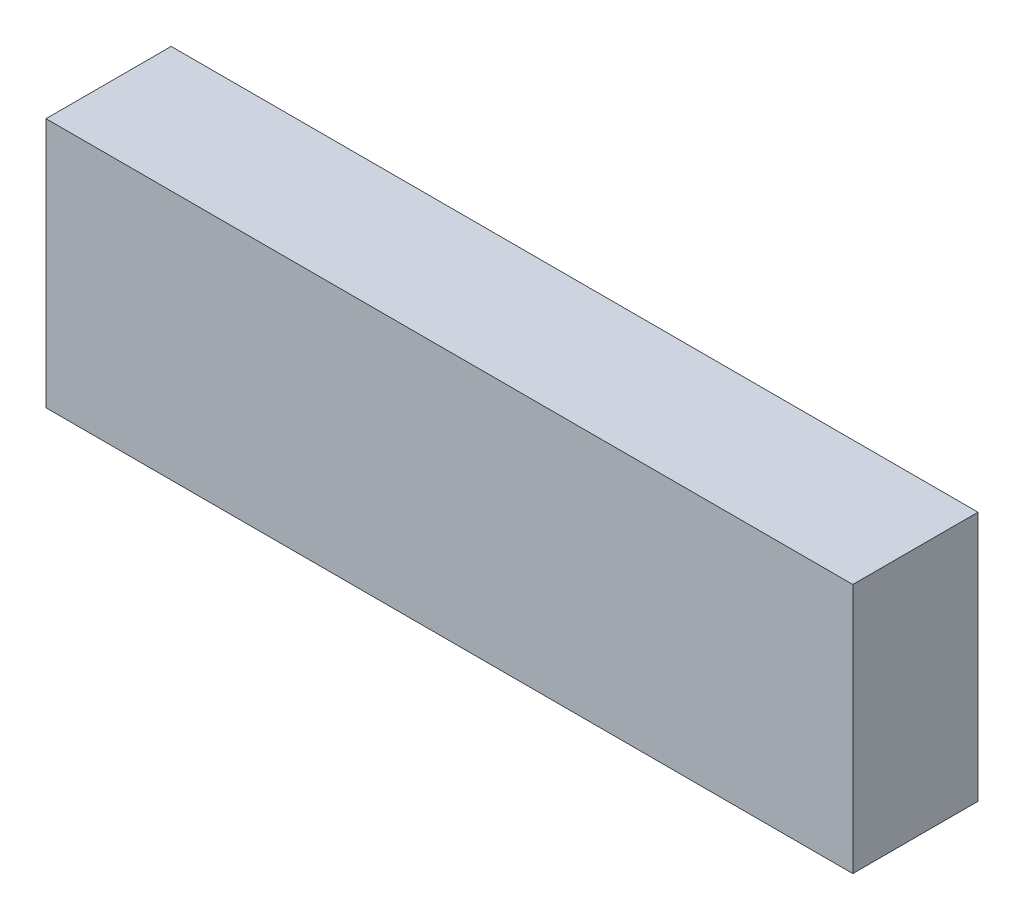
ISO-10303-21;
HEADER;
FILE_DESCRIPTION(('STEP AP214'),'2;1');
FILE_NAME('part.step','',(''),(''),'','','');
FILE_SCHEMA(('AUTOMOTIVE_DESIGN { 1 0 10303 214 1 1 1 1 }'));
ENDSEC;
DATA;
#1=APPLICATION_CONTEXT('core data for automotive mechanical design processes');
#2=APPLICATION_PROTOCOL_DEFINITION('international standard','automotive_design',2000,#1);
#3=PRODUCT_CONTEXT('',#1,'mechanical');
#4=PRODUCT('Part','Part','',(#3));
#5=PRODUCT_RELATED_PRODUCT_CATEGORY('part','',(#4));
#6=PRODUCT_DEFINITION_FORMATION('','',#4);
#7=PRODUCT_DEFINITION_CONTEXT('part definition',#1,'design');
#8=PRODUCT_DEFINITION('design','',#6,#7);
#9=PRODUCT_DEFINITION_SHAPE('','',#8);
#10=(LENGTH_UNIT() NAMED_UNIT(*) SI_UNIT(.MILLI.,.METRE.));
#11=(NAMED_UNIT(*) PLANE_ANGLE_UNIT() SI_UNIT($,.RADIAN.));
#12=(NAMED_UNIT(*) SI_UNIT($,.STERADIAN.) SOLID_ANGLE_UNIT());
#13=UNCERTAINTY_MEASURE_WITH_UNIT(LENGTH_MEASURE(1.E-05),#10,'distance_accuracy_value','');
#14=(GEOMETRIC_REPRESENTATION_CONTEXT(3) GLOBAL_UNCERTAINTY_ASSIGNED_CONTEXT((#13)) GLOBAL_UNIT_ASSIGNED_CONTEXT((#10,
#11,#12)) REPRESENTATION_CONTEXT('',''));
#15=CARTESIAN_POINT('',(0.,0.,0.));
#16=DIRECTION('',(0.,0.,1.));
#17=DIRECTION('',(1.,0.,0.));
#18=AXIS2_PLACEMENT_3D('',#15,#16,#17);
#19=CARTESIAN_POINT('',(72.4999999999995,547.758892294612,-402.857743681072));
#20=DIRECTION('',(0.,0.,1.));
#21=DIRECTION('',(1.,0.,0.));
#22=AXIS2_PLACEMENT_3D('',#19,#20,#21);
#23=PLANE('',#22);
#24=DIRECTION('',(1.,0.,0.));
#25=VECTOR('',#24,1.);
#26=CARTESIAN_POINT('',(-72.5000000000005,547.758892294612,-402.857743681072));
#27=LINE('',#26,#25);
#28=CARTESIAN_POINT('',(72.4999999999995,547.758892294612,-402.857743681072));
#29=VERTEX_POINT('',#28);
#30=CARTESIAN_POINT('',(-72.5000000000005,547.758892294612,-402.857743681072));
#31=VERTEX_POINT('',#30);
#32=EDGE_CURVE('E68',#29,#31,#27,.F.);
#33=ORIENTED_EDGE('',*,*,#32,.F.);
#34=DIRECTION('',(0.,1.,0.));
#35=VECTOR('',#34,1.);
#36=CARTESIAN_POINT('',(72.4999999999995,547.758892294612,-402.857743681072));
#37=LINE('',#36,#35);
#38=CARTESIAN_POINT('',(72.4999999999995,592.758892294612,-402.857743681072));
#39=VERTEX_POINT('',#38);
#40=EDGE_CURVE('E55',#39,#29,#37,.F.);
#41=ORIENTED_EDGE('',*,*,#40,.F.);
#42=DIRECTION('',(1.,0.,0.));
#43=VECTOR('',#42,1.);
#44=CARTESIAN_POINT('',(-72.5000000000005,592.758892294612,-402.857743681072));
#45=LINE('',#44,#43);
#46=CARTESIAN_POINT('',(-72.5000000000005,592.758892294612,-402.857743681072));
#47=VERTEX_POINT('',#46);
#48=EDGE_CURVE('E20',#39,#47,#45,.F.);
#49=ORIENTED_EDGE('',*,*,#48,.T.);
#50=DIRECTION('',(0.,-1.,0.));
#51=VECTOR('',#50,1.);
#52=CARTESIAN_POINT('',(-72.5000000000004,592.758892294612,-402.857743681072));
#53=LINE('',#52,#51);
#54=EDGE_CURVE('E81',#31,#47,#53,.F.);
#55=ORIENTED_EDGE('',*,*,#54,.F.);
#56=EDGE_LOOP('',(#33,#41,#49,#55));
#57=FACE_BOUND('',#56,.T.);
#58=ADVANCED_FACE('F17',(#57),#23,.T.);
#59=CARTESIAN_POINT('',(-72.5000000000005,592.758892294612,-425.357743681072));
#60=DIRECTION('',(0.,-1.,0.));
#61=DIRECTION('',(1.,0.,0.));
#62=AXIS2_PLACEMENT_3D('',#59,#60,#61);
#63=PLANE('',#62);
#64=DIRECTION('',(0.,0.,1.));
#65=VECTOR('',#64,1.);
#66=CARTESIAN_POINT('',(-72.5000000000004,592.758892294612,-425.357743681072));
#67=LINE('',#66,#65);
#68=CARTESIAN_POINT('',(-72.5000000000005,592.758892294612,-425.357743681072));
#69=VERTEX_POINT('',#68);
#70=EDGE_CURVE('E64',#47,#69,#67,.F.);
#71=ORIENTED_EDGE('',*,*,#70,.F.);
#72=ORIENTED_EDGE('',*,*,#48,.F.);
#73=DIRECTION('',(0.,0.,1.));
#74=VECTOR('',#73,1.);
#75=CARTESIAN_POINT('',(72.4999999999995,592.758892294612,-425.357743681072));
#76=LINE('',#75,#74);
#77=CARTESIAN_POINT('',(72.4999999999995,592.758892294612,-425.357743681072));
#78=VERTEX_POINT('',#77);
#79=EDGE_CURVE('E61',#78,#39,#76,.T.);
#80=ORIENTED_EDGE('',*,*,#79,.F.);
#81=DIRECTION('',(-1.,0.,0.));
#82=VECTOR('',#81,1.);
#83=CARTESIAN_POINT('',(72.4999999999996,592.758892294612,-425.357743681072));
#84=LINE('',#83,#82);
#85=EDGE_CURVE('E83',#69,#78,#84,.F.);
#86=ORIENTED_EDGE('',*,*,#85,.F.);
#87=EDGE_LOOP('',(#71,#72,#80,#86));
#88=FACE_BOUND('',#87,.T.);
#89=ADVANCED_FACE('F60',(#88),#63,.F.);
#90=CARTESIAN_POINT('',(72.4999999999995,547.758892294612,-425.357743681072));
#91=DIRECTION('',(1.,0.,0.));
#92=DIRECTION('',(0.,1.,0.));
#93=AXIS2_PLACEMENT_3D('',#90,#91,#92);
#94=PLANE('',#93);
#95=DIRECTION('',(0.,0.,1.));
#96=VECTOR('',#95,1.);
#97=CARTESIAN_POINT('',(72.4999999999995,547.758892294612,-425.357743681072));
#98=LINE('',#97,#96);
#99=CARTESIAN_POINT('',(72.4999999999995,547.758892294612,-425.357743681072));
#100=VERTEX_POINT('',#99);
#101=EDGE_CURVE('E70',#100,#29,#98,.T.);
#102=ORIENTED_EDGE('',*,*,#101,.F.);
#103=DIRECTION('',(0.,1.,0.));
#104=VECTOR('',#103,1.);
#105=CARTESIAN_POINT('',(72.4999999999995,592.758892294612,-425.357743681072));
#106=LINE('',#105,#104);
#107=EDGE_CURVE('E74',#78,#100,#106,.F.);
#108=ORIENTED_EDGE('',*,*,#107,.F.);
#109=ORIENTED_EDGE('',*,*,#79,.T.);
#110=ORIENTED_EDGE('',*,*,#40,.T.);
#111=EDGE_LOOP('',(#102,#108,#109,#110));
#112=FACE_BOUND('',#111,.T.);
#113=ADVANCED_FACE('F72',(#112),#94,.T.);
#114=CARTESIAN_POINT('',(-72.5000000000005,547.758892294612,-425.357743681072));
#115=DIRECTION('',(0.,-1.,0.));
#116=DIRECTION('',(1.,0.,0.));
#117=AXIS2_PLACEMENT_3D('',#114,#115,#116);
#118=PLANE('',#117);
#119=DIRECTION('',(0.,0.,1.));
#120=VECTOR('',#119,1.);
#121=CARTESIAN_POINT('',(-72.5000000000004,547.758892294612,-425.357743681072));
#122=LINE('',#121,#120);
#123=CARTESIAN_POINT('',(-72.5000000000005,547.758892294612,-425.357743681072));
#124=VERTEX_POINT('',#123);
#125=EDGE_CURVE('E35',#124,#31,#122,.T.);
#126=ORIENTED_EDGE('',*,*,#125,.F.);
#127=DIRECTION('',(-1.,0.,0.));
#128=VECTOR('',#127,1.);
#129=CARTESIAN_POINT('',(72.4999999999996,547.758892294612,-425.357743681072));
#130=LINE('',#129,#128);
#131=EDGE_CURVE('E26',#100,#124,#130,.T.);
#132=ORIENTED_EDGE('',*,*,#131,.F.);
#133=ORIENTED_EDGE('',*,*,#101,.T.);
#134=ORIENTED_EDGE('',*,*,#32,.T.);
#135=EDGE_LOOP('',(#126,#132,#133,#134));
#136=FACE_BOUND('',#135,.T.);
#137=ADVANCED_FACE('F89',(#136),#118,.T.);
#138=CARTESIAN_POINT('',(-72.5000000000004,592.758892294612,-425.357743681072));
#139=DIRECTION('',(-1.,0.,0.));
#140=DIRECTION('',(0.,-1.,0.));
#141=AXIS2_PLACEMENT_3D('',#138,#139,#140);
#142=PLANE('',#141);
#143=ORIENTED_EDGE('',*,*,#125,.T.);
#144=ORIENTED_EDGE('',*,*,#54,.T.);
#145=ORIENTED_EDGE('',*,*,#70,.T.);
#146=DIRECTION('',(0.,1.,0.));
#147=VECTOR('',#146,1.);
#148=CARTESIAN_POINT('',(-72.5000000000005,592.758892294612,-425.357743681072));
#149=LINE('',#148,#147);
#150=EDGE_CURVE('E11',#124,#69,#149,.T.);
#151=ORIENTED_EDGE('',*,*,#150,.F.);
#152=EDGE_LOOP('',(#143,#144,#145,#151));
#153=FACE_BOUND('',#152,.T.);
#154=ADVANCED_FACE('F91',(#153),#142,.T.);
#155=CARTESIAN_POINT('',(72.4999999999996,592.758892294612,-425.357743681072));
#156=DIRECTION('',(0.,0.,-1.));
#157=DIRECTION('',(-1.,0.,0.));
#158=AXIS2_PLACEMENT_3D('',#155,#156,#157);
#159=PLANE('',#158);
#160=ORIENTED_EDGE('',*,*,#131,.T.);
#161=ORIENTED_EDGE('',*,*,#150,.T.);
#162=ORIENTED_EDGE('',*,*,#85,.T.);
#163=ORIENTED_EDGE('',*,*,#107,.T.);
#164=EDGE_LOOP('',(#160,#161,#162,#163));
#165=FACE_BOUND('',#164,.T.);
#166=ADVANCED_FACE('F88',(#165),#159,.T.);
#167=CLOSED_SHELL('',(#58,#89,#113,#137,#154,#166));
#168=MANIFOLD_SOLID_BREP('B1',#167);
#169=ADVANCED_BREP_SHAPE_REPRESENTATION('',(#18,#168),#14);
#170=SHAPE_DEFINITION_REPRESENTATION(#9,#169);
ENDSEC;
END-ISO-10303-21;
